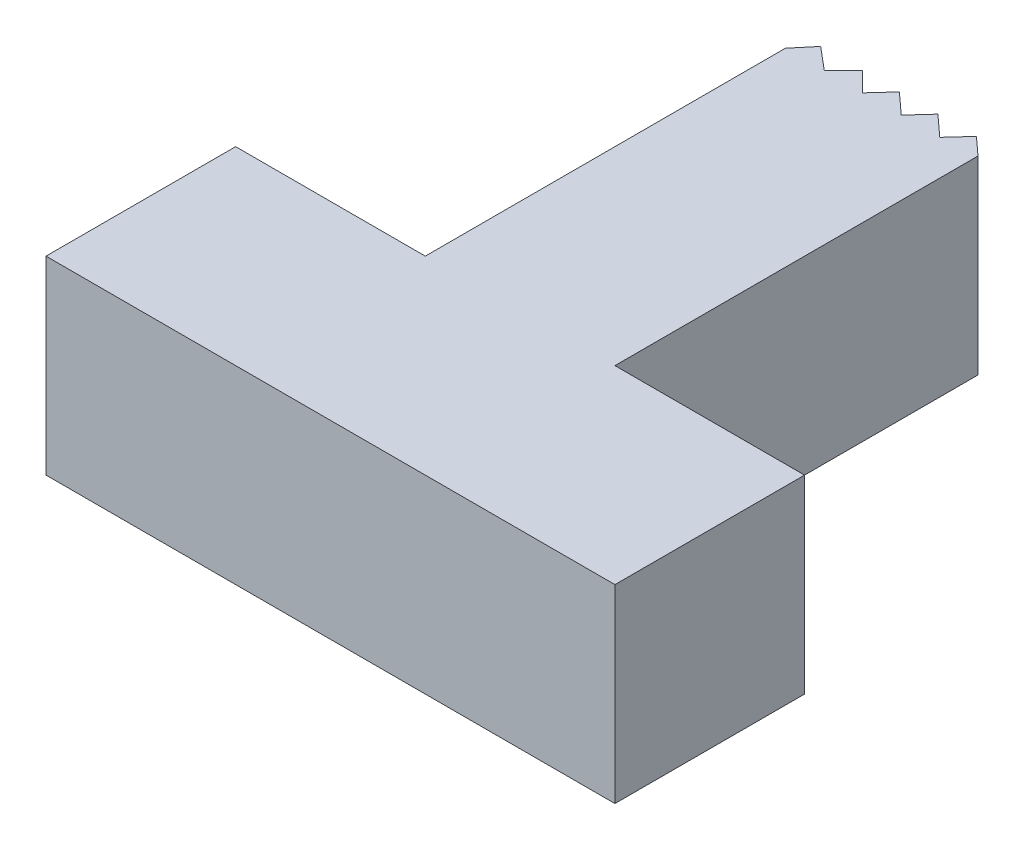
ISO-10303-21;
HEADER;
FILE_DESCRIPTION(('STEP AP214'),'2;1');
FILE_NAME('part.step','',(''),(''),'','','');
FILE_SCHEMA(('AUTOMOTIVE_DESIGN { 1 0 10303 214 1 1 1 1 }'));
ENDSEC;
DATA;
#1=APPLICATION_CONTEXT('core data for automotive mechanical design processes');
#2=APPLICATION_PROTOCOL_DEFINITION('international standard','automotive_design',2000,#1);
#3=PRODUCT_CONTEXT('',#1,'mechanical');
#4=PRODUCT('Part','Part','',(#3));
#5=PRODUCT_RELATED_PRODUCT_CATEGORY('part','',(#4));
#6=PRODUCT_DEFINITION_FORMATION('','',#4);
#7=PRODUCT_DEFINITION_CONTEXT('part definition',#1,'design');
#8=PRODUCT_DEFINITION('design','',#6,#7);
#9=PRODUCT_DEFINITION_SHAPE('','',#8);
#10=(LENGTH_UNIT() NAMED_UNIT(*) SI_UNIT(.MILLI.,.METRE.));
#11=(NAMED_UNIT(*) PLANE_ANGLE_UNIT() SI_UNIT($,.RADIAN.));
#12=(NAMED_UNIT(*) SI_UNIT($,.STERADIAN.) SOLID_ANGLE_UNIT());
#13=UNCERTAINTY_MEASURE_WITH_UNIT(LENGTH_MEASURE(1.E-05),#10,'distance_accuracy_value','');
#14=(GEOMETRIC_REPRESENTATION_CONTEXT(3) GLOBAL_UNCERTAINTY_ASSIGNED_CONTEXT((#13)) GLOBAL_UNIT_ASSIGNED_CONTEXT((#10,
#11,#12)) REPRESENTATION_CONTEXT('',''));
#15=CARTESIAN_POINT('',(0.,0.,0.));
#16=DIRECTION('',(0.,0.,1.));
#17=DIRECTION('',(1.,0.,0.));
#18=AXIS2_PLACEMENT_3D('',#15,#16,#17);
#19=CARTESIAN_POINT('',(0.,0.,0.));
#20=DIRECTION('',(0.,0.,1.));
#21=DIRECTION('',(1.,0.,0.));
#22=AXIS2_PLACEMENT_3D('',#19,#20,#21);
#23=PLANE('',#22);
#24=DIRECTION('',(0.,1.,0.));
#25=VECTOR('',#24,1.);
#26=CARTESIAN_POINT('',(-1.,0.999999999999999,0.));
#27=LINE('',#26,#25);
#28=CARTESIAN_POINT('',(-1.,-0.999999999999999,0.));
#29=VERTEX_POINT('',#28);
#30=CARTESIAN_POINT('',(-1.,1.,0.));
#31=VERTEX_POINT('',#30);
#32=EDGE_CURVE('E174',#29,#31,#27,.T.);
#33=ORIENTED_EDGE('',*,*,#32,.F.);
#34=DIRECTION('',(1.,0.,0.));
#35=VECTOR('',#34,1.);
#36=CARTESIAN_POINT('',(-2.99999999999999,-0.999999999999999,0.));
#37=LINE('',#36,#35);
#38=CARTESIAN_POINT('',(-2.99999999999999,-0.999999999999999,0.));
#39=VERTEX_POINT('',#38);
#40=EDGE_CURVE('E189',#39,#29,#37,.T.);
#41=ORIENTED_EDGE('',*,*,#40,.F.);
#42=DIRECTION('',(0.,-1.,0.));
#43=VECTOR('',#42,1.);
#44=CARTESIAN_POINT('',(-2.99999999999999,1.,0.));
#45=LINE('',#44,#43);
#46=CARTESIAN_POINT('',(-2.99999999999999,1.,0.));
#47=VERTEX_POINT('',#46);
#48=EDGE_CURVE('E199',#47,#39,#45,.T.);
#49=ORIENTED_EDGE('',*,*,#48,.F.);
#50=DIRECTION('',(-1.,0.,0.));
#51=VECTOR('',#50,1.);
#52=CARTESIAN_POINT('',(-2.99999999999999,1.,0.));
#53=LINE('',#52,#51);
#54=EDGE_CURVE('E179',#31,#47,#53,.T.);
#55=ORIENTED_EDGE('',*,*,#54,.F.);
#56=EDGE_LOOP('',(#33,#41,#49,#55));
#57=FACE_BOUND('',#56,.T.);
#58=ADVANCED_FACE('F34',(#57),#23,.F.);
#59=DIRECTION('',(0.,-1.,0.));
#60=VECTOR('',#59,1.);
#61=CARTESIAN_POINT('',(1.,0.999999999999999,0.));
#62=LINE('',#61,#60);
#63=CARTESIAN_POINT('',(1.,1.,0.));
#64=VERTEX_POINT('',#63);
#65=CARTESIAN_POINT('',(1.,-0.999999999999999,0.));
#66=VERTEX_POINT('',#65);
#67=EDGE_CURVE('E234',#64,#66,#62,.T.);
#68=ORIENTED_EDGE('',*,*,#67,.F.);
#69=CARTESIAN_POINT('',(3.,1.,0.));
#70=VERTEX_POINT('',#69);
#71=EDGE_CURVE('E196',#70,#64,#53,.T.);
#72=ORIENTED_EDGE('',*,*,#71,.F.);
#73=DIRECTION('',(0.,1.,0.));
#74=VECTOR('',#73,1.);
#75=CARTESIAN_POINT('',(3.,1.,0.));
#76=LINE('',#75,#74);
#77=CARTESIAN_POINT('',(3.,-0.999999999999999,0.));
#78=VERTEX_POINT('',#77);
#79=EDGE_CURVE('E175',#78,#70,#76,.T.);
#80=ORIENTED_EDGE('',*,*,#79,.F.);
#81=EDGE_CURVE('E201',#66,#78,#37,.T.);
#82=ORIENTED_EDGE('',*,*,#81,.F.);
#83=EDGE_LOOP('',(#68,#72,#80,#82));
#84=FACE_BOUND('',#83,.T.);
#85=ADVANCED_FACE('F232',(#84),#23,.F.);
#86=CARTESIAN_POINT('',(3.,1.,2.));
#87=DIRECTION('',(-1.,0.,0.));
#88=DIRECTION('',(0.,0.,1.));
#89=AXIS2_PLACEMENT_3D('',#86,#87,#88);
#90=PLANE('',#89);
#91=ORIENTED_EDGE('',*,*,#79,.T.);
#92=DIRECTION('',(0.,0.,-1.));
#93=VECTOR('',#92,1.);
#94=CARTESIAN_POINT('',(3.,1.,2.));
#95=LINE('',#94,#93);
#96=CARTESIAN_POINT('',(3.,1.,2.));
#97=VERTEX_POINT('',#96);
#98=EDGE_CURVE('E11',#97,#70,#95,.T.);
#99=ORIENTED_EDGE('',*,*,#98,.F.);
#100=DIRECTION('',(0.,1.,0.));
#101=VECTOR('',#100,1.);
#102=CARTESIAN_POINT('',(3.,1.,2.));
#103=LINE('',#102,#101);
#104=CARTESIAN_POINT('',(3.,-0.999999999999999,2.));
#105=VERTEX_POINT('',#104);
#106=EDGE_CURVE('E185',#105,#97,#103,.T.);
#107=ORIENTED_EDGE('',*,*,#106,.F.);
#108=DIRECTION('',(0.,0.,-1.));
#109=VECTOR('',#108,1.);
#110=CARTESIAN_POINT('',(3.,-0.999999999999999,2.));
#111=LINE('',#110,#109);
#112=EDGE_CURVE('E194',#105,#78,#111,.T.);
#113=ORIENTED_EDGE('',*,*,#112,.T.);
#114=EDGE_LOOP('',(#91,#99,#107,#113));
#115=FACE_BOUND('',#114,.T.);
#116=ADVANCED_FACE('F36',(#115),#90,.F.);
#117=CARTESIAN_POINT('',(-2.99999999999999,1.,2.));
#118=DIRECTION('',(0.,-1.,0.));
#119=DIRECTION('',(0.,0.,-1.));
#120=AXIS2_PLACEMENT_3D('',#117,#118,#119);
#121=PLANE('',#120);
#122=DIRECTION('',(0.,0.,1.));
#123=VECTOR('',#122,1.);
#124=CARTESIAN_POINT('',(1.,0.999999999999999,-4.));
#125=LINE('',#124,#123);
#126=CARTESIAN_POINT('',(1.,0.999999999999999,-3.82904896388143));
#127=VERTEX_POINT('',#126);
#128=EDGE_CURVE('E176',#127,#64,#125,.T.);
#129=ORIENTED_EDGE('',*,*,#128,.F.);
#130=DIRECTION('',(0.738862140529719,0.,0.673856614786738));
#131=VECTOR('',#130,1.);
#132=CARTESIAN_POINT('',(0.812557678145939,1.,-4.));
#133=LINE('',#132,#131);
#134=CARTESIAN_POINT('',(0.812557678145939,1.,-4.));
#135=VERTEX_POINT('',#134);
#136=EDGE_CURVE('E49',#135,#127,#133,.T.);
#137=ORIENTED_EDGE('',*,*,#136,.F.);
#138=DIRECTION('',(0.673856614786737,0.,-0.738862140529719));
#139=VECTOR('',#138,1.);
#140=CARTESIAN_POINT('',(0.628073470795933,1.,-3.79771899044177));
#141=LINE('',#140,#139);
#142=CARTESIAN_POINT('',(0.628073470795933,1.,-3.79771899044177));
#143=VERTEX_POINT('',#142);
#144=EDGE_CURVE('E250',#143,#135,#141,.T.);
#145=ORIENTED_EDGE('',*,*,#144,.F.);
#146=DIRECTION('',(0.738862140529719,0.,0.673856614786737));
#147=VECTOR('',#146,1.);
#148=CARTESIAN_POINT('',(0.406278839072969,1.,-4.));
#149=LINE('',#148,#147);
#150=CARTESIAN_POINT('',(0.406278839072969,1.,-4.));
#151=VERTEX_POINT('',#150);
#152=EDGE_CURVE('E252',#151,#143,#149,.T.);
#153=ORIENTED_EDGE('',*,*,#152,.F.);
#154=DIRECTION('',(0.673856614786738,0.,-0.738862140529719));
#155=VECTOR('',#154,1.);
#156=CARTESIAN_POINT('',(0.221794631722964,1.,-3.79771899044177));
#157=LINE('',#156,#155);
#158=CARTESIAN_POINT('',(0.221794631722964,1.,-3.79771899044177));
#159=VERTEX_POINT('',#158);
#160=EDGE_CURVE('E305',#159,#151,#157,.T.);
#161=ORIENTED_EDGE('',*,*,#160,.F.);
#162=DIRECTION('',(0.738862140529719,0.,0.673856614786738));
#163=VECTOR('',#162,1.);
#164=CARTESIAN_POINT('',(0.,1.,-4.));
#165=LINE('',#164,#163);
#166=CARTESIAN_POINT('',(0.,1.,-4.));
#167=VERTEX_POINT('',#166);
#168=EDGE_CURVE('E306',#167,#159,#165,.T.);
#169=ORIENTED_EDGE('',*,*,#168,.F.);
#170=DIRECTION('',(0.673856614786738,0.,-0.738862140529719));
#171=VECTOR('',#170,1.);
#172=CARTESIAN_POINT('',(-0.184484207350006,1.,-3.79771899044177));
#173=LINE('',#172,#171);
#174=CARTESIAN_POINT('',(-0.184484207350006,1.,-3.79771899044177));
#175=VERTEX_POINT('',#174);
#176=EDGE_CURVE('E311',#175,#167,#173,.T.);
#177=ORIENTED_EDGE('',*,*,#176,.F.);
#178=DIRECTION('',(0.708774430454067,0.,0.705435189606043));
#179=VECTOR('',#178,1.);
#180=CARTESIAN_POINT('',(-0.387722732240402,1.,-4.));
#181=LINE('',#180,#179);
#182=CARTESIAN_POINT('',(-0.387722732240402,1.,-4.));
#183=VERTEX_POINT('',#182);
#184=EDGE_CURVE('E314',#183,#175,#181,.T.);
#185=ORIENTED_EDGE('',*,*,#184,.F.);
#186=DIRECTION('',(0.705435189606043,0.,-0.708774430454066));
#187=VECTOR('',#186,1.);
#188=CARTESIAN_POINT('',(-0.589050737597476,1.,-3.79771899044177));
#189=LINE('',#188,#187);
#190=CARTESIAN_POINT('',(-0.589050737597476,1.,-3.79771899044177));
#191=VERTEX_POINT('',#190);
#192=EDGE_CURVE('E317',#191,#183,#189,.T.);
#193=ORIENTED_EDGE('',*,*,#192,.F.);
#194=DIRECTION('',(0.766688938531538,0.,0.642018747026427));
#195=VECTOR('',#194,1.);
#196=CARTESIAN_POINT('',(-0.830611616032237,1.,-4.));
#197=LINE('',#196,#195);
#198=CARTESIAN_POINT('',(-0.830611616032237,1.,-4.));
#199=VERTEX_POINT('',#198);
#200=EDGE_CURVE('E169',#199,#191,#197,.T.);
#201=ORIENTED_EDGE('',*,*,#200,.F.);
#202=DIRECTION('',(0.642018747026428,0.,-0.766688938531537));
#203=VECTOR('',#202,1.);
#204=CARTESIAN_POINT('',(-1.,1.,-3.79771899044177));
#205=LINE('',#204,#203);
#206=CARTESIAN_POINT('',(-1.,1.,-3.79771899044177));
#207=VERTEX_POINT('',#206);
#208=EDGE_CURVE('E157',#207,#199,#205,.T.);
#209=ORIENTED_EDGE('',*,*,#208,.F.);
#210=DIRECTION('',(0.,0.,1.));
#211=VECTOR('',#210,1.);
#212=CARTESIAN_POINT('',(-1.,0.999999999999999,-4.));
#213=LINE('',#212,#211);
#214=EDGE_CURVE('E57',#207,#31,#213,.T.);
#215=ORIENTED_EDGE('',*,*,#214,.T.);
#216=ORIENTED_EDGE('',*,*,#54,.T.);
#217=DIRECTION('',(0.,0.,-1.));
#218=VECTOR('',#217,1.);
#219=CARTESIAN_POINT('',(-2.99999999999999,1.,2.));
#220=LINE('',#219,#218);
#221=CARTESIAN_POINT('',(-2.99999999999999,1.,2.));
#222=VERTEX_POINT('',#221);
#223=EDGE_CURVE('E42',#222,#47,#220,.T.);
#224=ORIENTED_EDGE('',*,*,#223,.F.);
#225=DIRECTION('',(-1.,0.,0.));
#226=VECTOR('',#225,1.);
#227=CARTESIAN_POINT('',(-2.99999999999999,1.,2.));
#228=LINE('',#227,#226);
#229=EDGE_CURVE('E188',#97,#222,#228,.T.);
#230=ORIENTED_EDGE('',*,*,#229,.F.);
#231=ORIENTED_EDGE('',*,*,#98,.T.);
#232=ORIENTED_EDGE('',*,*,#71,.T.);
#233=EDGE_LOOP('',(#129,#137,#145,#153,#161,#169,#177,#185,#193,#201,#209,#215,#216,#224,#230,
#231,#232));
#234=FACE_BOUND('',#233,.T.);
#235=ADVANCED_FACE('F166',(#234),#121,.F.);
#236=CARTESIAN_POINT('',(-2.99999999999999,1.,2.));
#237=DIRECTION('',(1.,0.,0.));
#238=DIRECTION('',(0.,0.,-1.));
#239=AXIS2_PLACEMENT_3D('',#236,#237,#238);
#240=PLANE('',#239);
#241=ORIENTED_EDGE('',*,*,#48,.T.);
#242=DIRECTION('',(0.,0.,-1.));
#243=VECTOR('',#242,1.);
#244=CARTESIAN_POINT('',(-2.99999999999999,-0.999999999999999,2.));
#245=LINE('',#244,#243);
#246=CARTESIAN_POINT('',(-2.99999999999999,-0.999999999999999,2.));
#247=VERTEX_POINT('',#246);
#248=EDGE_CURVE('E206',#247,#39,#245,.T.);
#249=ORIENTED_EDGE('',*,*,#248,.F.);
#250=DIRECTION('',(0.,-1.,0.));
#251=VECTOR('',#250,1.);
#252=CARTESIAN_POINT('',(-2.99999999999999,1.,2.));
#253=LINE('',#252,#251);
#254=EDGE_CURVE('E191',#222,#247,#253,.T.);
#255=ORIENTED_EDGE('',*,*,#254,.F.);
#256=ORIENTED_EDGE('',*,*,#223,.T.);
#257=EDGE_LOOP('',(#241,#249,#255,#256));
#258=FACE_BOUND('',#257,.T.);
#259=ADVANCED_FACE('F213',(#258),#240,.F.);
#260=CARTESIAN_POINT('',(-2.99999999999999,-0.999999999999999,2.));
#261=DIRECTION('',(0.,1.,0.));
#262=DIRECTION('',(0.,0.,1.));
#263=AXIS2_PLACEMENT_3D('',#260,#261,#262);
#264=PLANE('',#263);
#265=DIRECTION('',(0.673856614786737,0.,-0.738862140529719));
#266=VECTOR('',#265,1.);
#267=CARTESIAN_POINT('',(-3.90598179329823,-0.999999999999999,1.17372701779973));
#268=LINE('',#267,#266);
#269=CARTESIAN_POINT('',(0.628073470795933,-0.999999999999999,-3.79771899044177));
#270=VERTEX_POINT('',#269);
#271=CARTESIAN_POINT('',(0.812557678145939,-0.999999999999999,-4.));
#272=VERTEX_POINT('',#271);
#273=EDGE_CURVE('E294',#270,#272,#268,.T.);
#274=ORIENTED_EDGE('',*,*,#273,.T.);
#275=DIRECTION('',(0.738862140529719,0.,0.673856614786738));
#276=VECTOR('',#275,1.);
#277=CARTESIAN_POINT('',(1.71853947144418,-0.999999999999999,-3.17372701779973));
#278=LINE('',#277,#276);
#279=CARTESIAN_POINT('',(1.,-0.999999999999999,-3.82904896388143));
#280=VERTEX_POINT('',#279);
#281=EDGE_CURVE('E239',#272,#280,#278,.T.);
#282=ORIENTED_EDGE('',*,*,#281,.T.);
#283=DIRECTION('',(0.,0.,1.));
#284=VECTOR('',#283,1.);
#285=CARTESIAN_POINT('',(1.,-0.999999999999999,-4.));
#286=LINE('',#285,#284);
#287=EDGE_CURVE('E181',#280,#66,#286,.T.);
#288=ORIENTED_EDGE('',*,*,#287,.T.);
#289=ORIENTED_EDGE('',*,*,#81,.T.);
#290=ORIENTED_EDGE('',*,*,#112,.F.);
#291=DIRECTION('',(1.,0.,0.));
#292=VECTOR('',#291,1.);
#293=CARTESIAN_POINT('',(-2.99999999999999,-0.999999999999999,2.));
#294=LINE('',#293,#292);
#295=EDGE_CURVE('E193',#247,#105,#294,.T.);
#296=ORIENTED_EDGE('',*,*,#295,.F.);
#297=ORIENTED_EDGE('',*,*,#248,.T.);
#298=ORIENTED_EDGE('',*,*,#40,.T.);
#299=DIRECTION('',(0.,0.,1.));
#300=VECTOR('',#299,1.);
#301=CARTESIAN_POINT('',(-1.,-0.999999999999999,-4.));
#302=LINE('',#301,#300);
#303=CARTESIAN_POINT('',(-1.,-0.999999999999999,-3.79771899044177));
#304=VERTEX_POINT('',#303);
#305=EDGE_CURVE('E220',#304,#29,#302,.T.);
#306=ORIENTED_EDGE('',*,*,#305,.F.);
#307=DIRECTION('',(0.642018747026428,0.,-0.766688938531538));
#308=VECTOR('',#307,1.);
#309=CARTESIAN_POINT('',(-4.67817966047707,-0.999999999999999,0.594706733387403));
#310=LINE('',#309,#308);
#311=CARTESIAN_POINT('',(-0.830611616032237,-0.999999999999999,-4.));
#312=VERTEX_POINT('',#311);
#313=EDGE_CURVE('E160',#304,#312,#310,.T.);
#314=ORIENTED_EDGE('',*,*,#313,.T.);
#315=DIRECTION('',(0.766688938531538,0.,0.642018747026428));
#316=VECTOR('',#315,1.);
#317=CARTESIAN_POINT('',(0.847568044444837,-0.999999999999999,-2.59470673338741));
#318=LINE('',#317,#316);
#319=CARTESIAN_POINT('',(-0.589050737597476,-0.999999999999999,-3.79771899044177));
#320=VERTEX_POINT('',#319);
#321=EDGE_CURVE('E273',#312,#320,#318,.T.);
#322=ORIENTED_EDGE('',*,*,#321,.T.);
#323=DIRECTION('',(0.705435189606043,0.,-0.708774430454066));
#324=VECTOR('',#323,1.);
#325=CARTESIAN_POINT('',(-4.68765982303966,-0.999999999999999,0.320291229335421));
#326=LINE('',#325,#324);
#327=CARTESIAN_POINT('',(-0.387722732240402,-0.999999999999999,-4.));
#328=VERTEX_POINT('',#327);
#329=EDGE_CURVE('E276',#320,#328,#326,.T.);
#330=ORIENTED_EDGE('',*,*,#329,.T.);
#331=DIRECTION('',(0.708774430454067,0.,0.705435189606043));
#332=VECTOR('',#331,1.);
#333=CARTESIAN_POINT('',(1.29993709079926,-0.999999999999999,-2.32029122933542));
#334=LINE('',#333,#332);
#335=CARTESIAN_POINT('',(-0.184484207350006,-0.999999999999999,-3.79771899044177));
#336=VERTEX_POINT('',#335);
#337=EDGE_CURVE('E279',#328,#336,#334,.T.);
#338=ORIENTED_EDGE('',*,*,#337,.T.);
#339=DIRECTION('',(0.673856614786738,0.,-0.738862140529719));
#340=VECTOR('',#339,1.);
#341=CARTESIAN_POINT('',(-4.34957105674416,-0.999999999999999,0.769164998683262));
#342=LINE('',#341,#340);
#343=CARTESIAN_POINT('',(0.,-0.999999999999999,-4.));
#344=VERTEX_POINT('',#343);
#345=EDGE_CURVE('E282',#336,#344,#342,.T.);
#346=ORIENTED_EDGE('',*,*,#345,.T.);
#347=DIRECTION('',(0.738862140529719,0.,0.673856614786738));
#348=VECTOR('',#347,1.);
#349=CARTESIAN_POINT('',(1.34957105674417,-0.999999999999999,-2.76916499868326));
#350=LINE('',#349,#348);
#351=CARTESIAN_POINT('',(0.221794631722964,-0.999999999999999,-3.79771899044177));
#352=VERTEX_POINT('',#351);
#353=EDGE_CURVE('E285',#344,#352,#350,.T.);
#354=ORIENTED_EDGE('',*,*,#353,.T.);
#355=DIRECTION('',(0.673856614786738,0.,-0.738862140529719));
#356=VECTOR('',#355,1.);
#357=CARTESIAN_POINT('',(-4.1277764250212,-0.999999999999999,0.971446008241497));
#358=LINE('',#357,#356);
#359=CARTESIAN_POINT('',(0.406278839072969,-0.999999999999999,-4.));
#360=VERTEX_POINT('',#359);
#361=EDGE_CURVE('E288',#352,#360,#358,.T.);
#362=ORIENTED_EDGE('',*,*,#361,.T.);
#363=DIRECTION('',(0.738862140529719,0.,0.673856614786737));
#364=VECTOR('',#363,1.);
#365=CARTESIAN_POINT('',(1.53405526409417,-0.999999999999999,-2.9714460082415));
#366=LINE('',#365,#364);
#367=EDGE_CURVE('E291',#360,#270,#366,.T.);
#368=ORIENTED_EDGE('',*,*,#367,.T.);
#369=EDGE_LOOP('',(#274,#282,#288,#289,#290,#296,#297,#298,#306,#314,#322,#330,#338,#346,#354,
#362,#368));
#370=FACE_BOUND('',#369,.T.);
#371=ADVANCED_FACE('F219',(#370),#264,.F.);
#372=CARTESIAN_POINT('',(0.,0.,2.));
#373=DIRECTION('',(0.,0.,1.));
#374=DIRECTION('',(1.,0.,0.));
#375=AXIS2_PLACEMENT_3D('',#372,#373,#374);
#376=PLANE('',#375);
#377=ORIENTED_EDGE('',*,*,#106,.T.);
#378=ORIENTED_EDGE('',*,*,#229,.T.);
#379=ORIENTED_EDGE('',*,*,#254,.T.);
#380=ORIENTED_EDGE('',*,*,#295,.T.);
#381=EDGE_LOOP('',(#377,#378,#379,#380));
#382=FACE_BOUND('',#381,.T.);
#383=ADVANCED_FACE('F225',(#382),#376,.T.);
#384=CARTESIAN_POINT('',(-1.,0.999999999999999,-4.));
#385=DIRECTION('',(1.,0.,0.));
#386=DIRECTION('',(0.,0.,-1.));
#387=AXIS2_PLACEMENT_3D('',#384,#385,#386);
#388=PLANE('',#387);
#389=ORIENTED_EDGE('',*,*,#214,.F.);
#390=DIRECTION('',(0.,1.,0.));
#391=VECTOR('',#390,1.);
#392=CARTESIAN_POINT('',(-1.,-3.,-3.79771899044177));
#393=LINE('',#392,#391);
#394=EDGE_CURVE('E154',#304,#207,#393,.T.);
#395=ORIENTED_EDGE('',*,*,#394,.F.);
#396=ORIENTED_EDGE('',*,*,#305,.T.);
#397=ORIENTED_EDGE('',*,*,#32,.T.);
#398=EDGE_LOOP('',(#389,#395,#396,#397));
#399=FACE_BOUND('',#398,.T.);
#400=ADVANCED_FACE('F172',(#399),#388,.F.);
#401=CARTESIAN_POINT('',(1.,0.999999999999999,-4.));
#402=DIRECTION('',(-1.,0.,0.));
#403=DIRECTION('',(0.,0.,1.));
#404=AXIS2_PLACEMENT_3D('',#401,#402,#403);
#405=PLANE('',#404);
#406=ORIENTED_EDGE('',*,*,#287,.F.);
#407=DIRECTION('',(0.,1.,0.));
#408=VECTOR('',#407,1.);
#409=CARTESIAN_POINT('',(1.,-3.,-3.82904896388143));
#410=LINE('',#409,#408);
#411=EDGE_CURVE('E244',#280,#127,#410,.T.);
#412=ORIENTED_EDGE('',*,*,#411,.T.);
#413=ORIENTED_EDGE('',*,*,#128,.T.);
#414=ORIENTED_EDGE('',*,*,#67,.T.);
#415=EDGE_LOOP('',(#406,#412,#413,#414));
#416=FACE_BOUND('',#415,.T.);
#417=ADVANCED_FACE('F243',(#416),#405,.F.);
#418=CARTESIAN_POINT('',(0.812557678145939,-3.,-4.));
#419=DIRECTION('',(-0.673856614786738,0.,0.738862140529719));
#420=DIRECTION('',(0.738862140529719,0.,0.673856614786738));
#421=AXIS2_PLACEMENT_3D('',#418,#419,#420);
#422=PLANE('',#421);
#423=DIRECTION('',(0.,1.,0.));
#424=VECTOR('',#423,1.);
#425=CARTESIAN_POINT('',(0.812557678145939,-3.,-4.));
#426=LINE('',#425,#424);
#427=EDGE_CURVE('E245',#272,#135,#426,.T.);
#428=ORIENTED_EDGE('',*,*,#427,.T.);
#429=ORIENTED_EDGE('',*,*,#136,.T.);
#430=ORIENTED_EDGE('',*,*,#411,.F.);
#431=ORIENTED_EDGE('',*,*,#281,.F.);
#432=EDGE_LOOP('',(#428,#429,#430,#431));
#433=FACE_BOUND('',#432,.T.);
#434=ADVANCED_FACE('F403',(#433),#422,.F.);
#435=CARTESIAN_POINT('',(0.628073470795933,-3.,-3.79771899044177));
#436=DIRECTION('',(0.738862140529719,0.,0.673856614786737));
#437=DIRECTION('',(0.673856614786737,0.,-0.738862140529719));
#438=AXIS2_PLACEMENT_3D('',#435,#436,#437);
#439=PLANE('',#438);
#440=DIRECTION('',(0.,1.,0.));
#441=VECTOR('',#440,1.);
#442=CARTESIAN_POINT('',(0.628073470795933,-3.,-3.79771899044177));
#443=LINE('',#442,#441);
#444=EDGE_CURVE('E257',#270,#143,#443,.T.);
#445=ORIENTED_EDGE('',*,*,#444,.T.);
#446=ORIENTED_EDGE('',*,*,#144,.T.);
#447=ORIENTED_EDGE('',*,*,#427,.F.);
#448=ORIENTED_EDGE('',*,*,#273,.F.);
#449=EDGE_LOOP('',(#445,#446,#447,#448));
#450=FACE_BOUND('',#449,.T.);
#451=ADVANCED_FACE('F298',(#450),#439,.F.);
#452=CARTESIAN_POINT('',(0.406278839072969,-3.,-4.));
#453=DIRECTION('',(-0.673856614786737,0.,0.738862140529719));
#454=DIRECTION('',(0.738862140529719,0.,0.673856614786737));
#455=AXIS2_PLACEMENT_3D('',#452,#453,#454);
#456=PLANE('',#455);
#457=DIRECTION('',(0.,1.,0.));
#458=VECTOR('',#457,1.);
#459=CARTESIAN_POINT('',(0.406278839072969,-3.,-4.));
#460=LINE('',#459,#458);
#461=EDGE_CURVE('E259',#360,#151,#460,.T.);
#462=ORIENTED_EDGE('',*,*,#461,.T.);
#463=ORIENTED_EDGE('',*,*,#152,.T.);
#464=ORIENTED_EDGE('',*,*,#444,.F.);
#465=ORIENTED_EDGE('',*,*,#367,.F.);
#466=EDGE_LOOP('',(#462,#463,#464,#465));
#467=FACE_BOUND('',#466,.T.);
#468=ADVANCED_FACE('F301',(#467),#456,.F.);
#469=CARTESIAN_POINT('',(0.221794631722964,-3.,-3.79771899044177));
#470=DIRECTION('',(0.738862140529719,0.,0.673856614786738));
#471=DIRECTION('',(0.673856614786738,0.,-0.738862140529719));
#472=AXIS2_PLACEMENT_3D('',#469,#470,#471);
#473=PLANE('',#472);
#474=DIRECTION('',(0.,1.,0.));
#475=VECTOR('',#474,1.);
#476=CARTESIAN_POINT('',(0.221794631722964,-3.,-3.79771899044177));
#477=LINE('',#476,#475);
#478=EDGE_CURVE('E261',#352,#159,#477,.T.);
#479=ORIENTED_EDGE('',*,*,#478,.T.);
#480=ORIENTED_EDGE('',*,*,#160,.T.);
#481=ORIENTED_EDGE('',*,*,#461,.F.);
#482=ORIENTED_EDGE('',*,*,#361,.F.);
#483=EDGE_LOOP('',(#479,#480,#481,#482));
#484=FACE_BOUND('',#483,.T.);
#485=ADVANCED_FACE('F339',(#484),#473,.F.);
#486=CARTESIAN_POINT('',(0.,-3.,-4.));
#487=DIRECTION('',(-0.673856614786738,0.,0.738862140529719));
#488=DIRECTION('',(0.738862140529719,0.,0.673856614786738));
#489=AXIS2_PLACEMENT_3D('',#486,#487,#488);
#490=PLANE('',#489);
#491=DIRECTION('',(0.,1.,0.));
#492=VECTOR('',#491,1.);
#493=CARTESIAN_POINT('',(0.,-3.,-4.));
#494=LINE('',#493,#492);
#495=EDGE_CURVE('E263',#344,#167,#494,.T.);
#496=ORIENTED_EDGE('',*,*,#495,.T.);
#497=ORIENTED_EDGE('',*,*,#168,.T.);
#498=ORIENTED_EDGE('',*,*,#478,.F.);
#499=ORIENTED_EDGE('',*,*,#353,.F.);
#500=EDGE_LOOP('',(#496,#497,#498,#499));
#501=FACE_BOUND('',#500,.T.);
#502=ADVANCED_FACE('F336',(#501),#490,.F.);
#503=CARTESIAN_POINT('',(-0.184484207350006,-3.,-3.79771899044177));
#504=DIRECTION('',(0.738862140529719,0.,0.673856614786738));
#505=DIRECTION('',(0.673856614786738,0.,-0.738862140529719));
#506=AXIS2_PLACEMENT_3D('',#503,#504,#505);
#507=PLANE('',#506);
#508=DIRECTION('',(0.,1.,0.));
#509=VECTOR('',#508,1.);
#510=CARTESIAN_POINT('',(-0.184484207350006,-3.,-3.79771899044177));
#511=LINE('',#510,#509);
#512=EDGE_CURVE('E265',#336,#175,#511,.T.);
#513=ORIENTED_EDGE('',*,*,#512,.T.);
#514=ORIENTED_EDGE('',*,*,#176,.T.);
#515=ORIENTED_EDGE('',*,*,#495,.F.);
#516=ORIENTED_EDGE('',*,*,#345,.F.);
#517=EDGE_LOOP('',(#513,#514,#515,#516));
#518=FACE_BOUND('',#517,.T.);
#519=ADVANCED_FACE('F332',(#518),#507,.F.);
#520=CARTESIAN_POINT('',(-0.387722732240402,-3.,-4.));
#521=DIRECTION('',(-0.705435189606043,0.,0.708774430454067));
#522=DIRECTION('',(0.708774430454067,0.,0.705435189606043));
#523=AXIS2_PLACEMENT_3D('',#520,#521,#522);
#524=PLANE('',#523);
#525=DIRECTION('',(0.,1.,0.));
#526=VECTOR('',#525,1.);
#527=CARTESIAN_POINT('',(-0.387722732240402,-3.,-4.));
#528=LINE('',#527,#526);
#529=EDGE_CURVE('E267',#328,#183,#528,.T.);
#530=ORIENTED_EDGE('',*,*,#529,.T.);
#531=ORIENTED_EDGE('',*,*,#184,.T.);
#532=ORIENTED_EDGE('',*,*,#512,.F.);
#533=ORIENTED_EDGE('',*,*,#337,.F.);
#534=EDGE_LOOP('',(#530,#531,#532,#533));
#535=FACE_BOUND('',#534,.T.);
#536=ADVANCED_FACE('F330',(#535),#524,.F.);
#537=CARTESIAN_POINT('',(-0.589050737597476,-3.,-3.79771899044177));
#538=DIRECTION('',(0.708774430454066,0.,0.705435189606043));
#539=DIRECTION('',(0.705435189606043,0.,-0.708774430454066));
#540=AXIS2_PLACEMENT_3D('',#537,#538,#539);
#541=PLANE('',#540);
#542=DIRECTION('',(0.,1.,0.));
#543=VECTOR('',#542,1.);
#544=CARTESIAN_POINT('',(-0.589050737597476,-3.,-3.79771899044177));
#545=LINE('',#544,#543);
#546=EDGE_CURVE('E269',#320,#191,#545,.T.);
#547=ORIENTED_EDGE('',*,*,#546,.T.);
#548=ORIENTED_EDGE('',*,*,#192,.T.);
#549=ORIENTED_EDGE('',*,*,#529,.F.);
#550=ORIENTED_EDGE('',*,*,#329,.F.);
#551=EDGE_LOOP('',(#547,#548,#549,#550));
#552=FACE_BOUND('',#551,.T.);
#553=ADVANCED_FACE('F327',(#552),#541,.F.);
#554=CARTESIAN_POINT('',(-0.830611616032237,-3.,-4.));
#555=DIRECTION('',(-0.642018747026428,0.,0.766688938531538));
#556=DIRECTION('',(0.766688938531538,0.,0.642018747026428));
#557=AXIS2_PLACEMENT_3D('',#554,#555,#556);
#558=PLANE('',#557);
#559=DIRECTION('',(0.,1.,0.));
#560=VECTOR('',#559,1.);
#561=CARTESIAN_POINT('',(-0.830611616032237,-3.,-4.));
#562=LINE('',#561,#560);
#563=EDGE_CURVE('E163',#312,#199,#562,.T.);
#564=ORIENTED_EDGE('',*,*,#563,.T.);
#565=ORIENTED_EDGE('',*,*,#200,.T.);
#566=ORIENTED_EDGE('',*,*,#546,.F.);
#567=ORIENTED_EDGE('',*,*,#321,.F.);
#568=EDGE_LOOP('',(#564,#565,#566,#567));
#569=FACE_BOUND('',#568,.T.);
#570=ADVANCED_FACE('F322',(#569),#558,.F.);
#571=CARTESIAN_POINT('',(-1.,-3.,-3.79771899044177));
#572=DIRECTION('',(0.766688938531538,0.,0.642018747026428));
#573=DIRECTION('',(0.642018747026428,0.,-0.766688938531538));
#574=AXIS2_PLACEMENT_3D('',#571,#572,#573);
#575=PLANE('',#574);
#576=ORIENTED_EDGE('',*,*,#394,.T.);
#577=ORIENTED_EDGE('',*,*,#208,.T.);
#578=ORIENTED_EDGE('',*,*,#563,.F.);
#579=ORIENTED_EDGE('',*,*,#313,.F.);
#580=EDGE_LOOP('',(#576,#577,#578,#579));
#581=FACE_BOUND('',#580,.T.);
#582=ADVANCED_FACE('F155',(#581),#575,.F.);
#583=CLOSED_SHELL('',(#58,#85,#116,#235,#259,#371,#383,#400,#417,#434,#451,#468,#485,#502,#519,
#536,#553,#570,#582));
#584=MANIFOLD_SOLID_BREP('B2',#583);
#585=ADVANCED_BREP_SHAPE_REPRESENTATION('',(#18,#584),#14);
#586=SHAPE_DEFINITION_REPRESENTATION(#9,#585);
ENDSEC;
END-ISO-10303-21;
